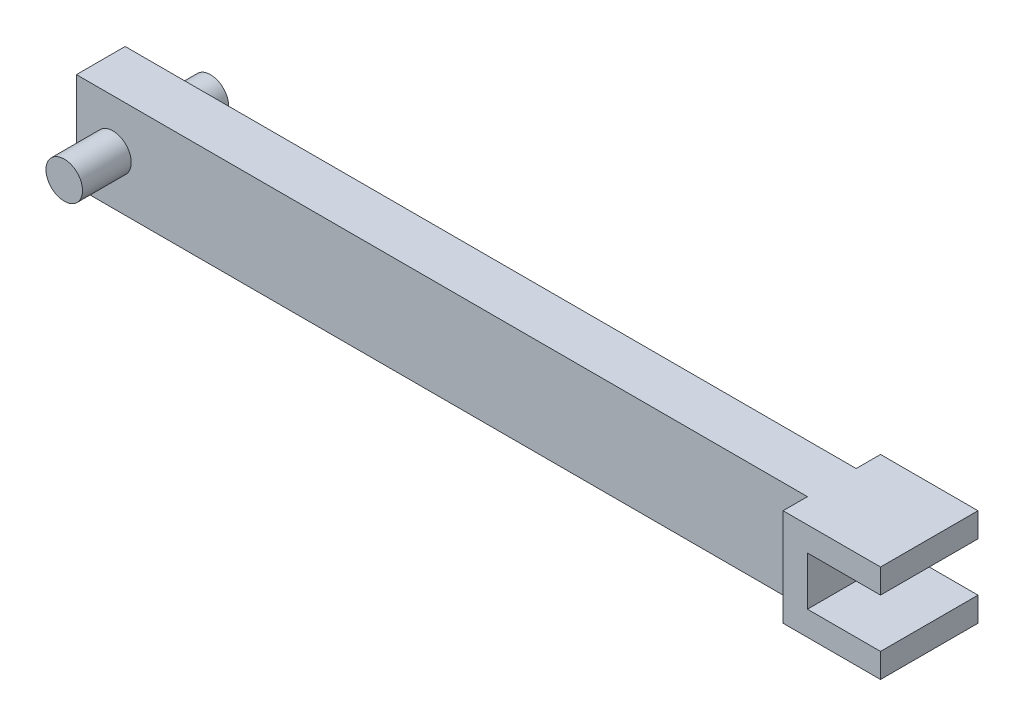
ISO-10303-21;
HEADER;
FILE_DESCRIPTION(('STEP AP214'),'2;1');
FILE_NAME('part.step','',(''),(''),'','','');
FILE_SCHEMA(('AUTOMOTIVE_DESIGN { 1 0 10303 214 1 1 1 1 }'));
ENDSEC;
DATA;
#1=APPLICATION_CONTEXT('core data for automotive mechanical design processes');
#2=APPLICATION_PROTOCOL_DEFINITION('international standard','automotive_design',2000,#1);
#3=PRODUCT_CONTEXT('',#1,'mechanical');
#4=PRODUCT('Part','Part','',(#3));
#5=PRODUCT_RELATED_PRODUCT_CATEGORY('part','',(#4));
#6=PRODUCT_DEFINITION_FORMATION('','',#4);
#7=PRODUCT_DEFINITION_CONTEXT('part definition',#1,'design');
#8=PRODUCT_DEFINITION('design','',#6,#7);
#9=PRODUCT_DEFINITION_SHAPE('','',#8);
#10=(LENGTH_UNIT() NAMED_UNIT(*) SI_UNIT(.MILLI.,.METRE.));
#11=(NAMED_UNIT(*) PLANE_ANGLE_UNIT() SI_UNIT($,.RADIAN.));
#12=(NAMED_UNIT(*) SI_UNIT($,.STERADIAN.) SOLID_ANGLE_UNIT());
#13=UNCERTAINTY_MEASURE_WITH_UNIT(LENGTH_MEASURE(1.E-05),#10,'distance_accuracy_value','');
#14=(GEOMETRIC_REPRESENTATION_CONTEXT(3) GLOBAL_UNCERTAINTY_ASSIGNED_CONTEXT((#13)) GLOBAL_UNIT_ASSIGNED_CONTEXT((#10,
#11,#12)) REPRESENTATION_CONTEXT('',''));
#15=CARTESIAN_POINT('',(0.,0.,0.));
#16=DIRECTION('',(0.,0.,1.));
#17=DIRECTION('',(1.,0.,0.));
#18=AXIS2_PLACEMENT_3D('',#15,#16,#17);
#19=CARTESIAN_POINT('',(190.,0.,0.));
#20=DIRECTION('',(-1.,0.,0.));
#21=DIRECTION('',(0.,0.,1.));
#22=AXIS2_PLACEMENT_3D('',#19,#20,#21);
#23=PLANE('',#22);
#24=DIRECTION('',(0.,1.,0.));
#25=VECTOR('',#24,1.);
#26=CARTESIAN_POINT('',(190.,-20.,-20.));
#27=LINE('',#26,#25);
#28=CARTESIAN_POINT('',(190.,-20.,-20.));
#29=VERTEX_POINT('',#28);
#30=CARTESIAN_POINT('',(190.,-10.,-20.));
#31=VERTEX_POINT('',#30);
#32=EDGE_CURVE('E163',#29,#31,#27,.T.);
#33=ORIENTED_EDGE('',*,*,#32,.T.);
#34=DIRECTION('',(0.,0.,1.));
#35=VECTOR('',#34,1.);
#36=CARTESIAN_POINT('',(190.,-10.,0.));
#37=LINE('',#36,#35);
#38=CARTESIAN_POINT('',(190.,-10.,20.));
#39=VERTEX_POINT('',#38);
#40=EDGE_CURVE('E11',#31,#39,#37,.T.);
#41=ORIENTED_EDGE('',*,*,#40,.T.);
#42=DIRECTION('',(0.,-1.,0.));
#43=VECTOR('',#42,1.);
#44=CARTESIAN_POINT('',(190.,-20.,20.));
#45=LINE('',#44,#43);
#46=CARTESIAN_POINT('',(190.,-20.,20.));
#47=VERTEX_POINT('',#46);
#48=EDGE_CURVE('E169',#39,#47,#45,.T.);
#49=ORIENTED_EDGE('',*,*,#48,.T.);
#50=DIRECTION('',(0.,0.,-1.));
#51=VECTOR('',#50,1.);
#52=CARTESIAN_POINT('',(190.,-20.,20.));
#53=LINE('',#52,#51);
#54=EDGE_CURVE('E172',#47,#29,#53,.T.);
#55=ORIENTED_EDGE('',*,*,#54,.T.);
#56=EDGE_LOOP('',(#33,#41,#49,#55));
#57=FACE_BOUND('',#56,.T.);
#58=ADVANCED_FACE('F33',(#57),#23,.F.);
#59=CARTESIAN_POINT('',(-150.,20.,10.));
#60=DIRECTION('',(0.,-1.,0.));
#61=DIRECTION('',(0.,0.,-1.));
#62=AXIS2_PLACEMENT_3D('',#59,#60,#61);
#63=PLANE('',#62);
#64=DIRECTION('',(-1.,0.,0.));
#65=VECTOR('',#64,1.);
#66=CARTESIAN_POINT('',(-150.,20.,-10.));
#67=LINE('',#66,#65);
#68=CARTESIAN_POINT('',(150.,20.,-10.));
#69=VERTEX_POINT('',#68);
#70=CARTESIAN_POINT('',(-150.,20.,-10.));
#71=VERTEX_POINT('',#70);
#72=EDGE_CURVE('E218',#69,#71,#67,.T.);
#73=ORIENTED_EDGE('',*,*,#72,.T.);
#74=DIRECTION('',(0.,0.,-1.));
#75=VECTOR('',#74,1.);
#76=CARTESIAN_POINT('',(-150.,20.,10.));
#77=LINE('',#76,#75);
#78=CARTESIAN_POINT('',(-150.,20.,10.));
#79=VERTEX_POINT('',#78);
#80=EDGE_CURVE('E224',#79,#71,#77,.T.);
#81=ORIENTED_EDGE('',*,*,#80,.F.);
#82=DIRECTION('',(-1.,0.,0.));
#83=VECTOR('',#82,1.);
#84=CARTESIAN_POINT('',(-150.,20.,10.));
#85=LINE('',#84,#83);
#86=CARTESIAN_POINT('',(150.,20.,10.));
#87=VERTEX_POINT('',#86);
#88=EDGE_CURVE('E210',#87,#79,#85,.T.);
#89=ORIENTED_EDGE('',*,*,#88,.F.);
#90=DIRECTION('',(0.,0.,1.));
#91=VECTOR('',#90,1.);
#92=CARTESIAN_POINT('',(150.,20.,20.));
#93=LINE('',#92,#91);
#94=CARTESIAN_POINT('',(150.,20.,20.));
#95=VERTEX_POINT('',#94);
#96=EDGE_CURVE('E78',#87,#95,#93,.T.);
#97=ORIENTED_EDGE('',*,*,#96,.T.);
#98=DIRECTION('',(-1.,0.,0.));
#99=VECTOR('',#98,1.);
#100=CARTESIAN_POINT('',(190.,20.,20.));
#101=LINE('',#100,#99);
#102=CARTESIAN_POINT('',(190.,20.,20.));
#103=VERTEX_POINT('',#102);
#104=EDGE_CURVE('E191',#103,#95,#101,.T.);
#105=ORIENTED_EDGE('',*,*,#104,.F.);
#106=DIRECTION('',(0.,0.,1.));
#107=VECTOR('',#106,1.);
#108=CARTESIAN_POINT('',(190.,20.,20.));
#109=LINE('',#108,#107);
#110=CARTESIAN_POINT('',(190.,20.,-20.));
#111=VERTEX_POINT('',#110);
#112=EDGE_CURVE('E166',#111,#103,#109,.T.);
#113=ORIENTED_EDGE('',*,*,#112,.F.);
#114=DIRECTION('',(-1.,0.,0.));
#115=VECTOR('',#114,1.);
#116=CARTESIAN_POINT('',(190.,20.,-20.));
#117=LINE('',#116,#115);
#118=CARTESIAN_POINT('',(150.,20.,-20.));
#119=VERTEX_POINT('',#118);
#120=EDGE_CURVE('E194',#111,#119,#117,.T.);
#121=ORIENTED_EDGE('',*,*,#120,.T.);
#122=EDGE_CURVE('E177',#119,#69,#93,.T.);
#123=ORIENTED_EDGE('',*,*,#122,.T.);
#124=EDGE_LOOP('',(#73,#81,#89,#97,#105,#113,#121,#123));
#125=FACE_BOUND('',#124,.T.);
#126=ADVANCED_FACE('F35',(#125),#63,.F.);
#127=CARTESIAN_POINT('',(-150.,20.,10.));
#128=DIRECTION('',(1.,0.,0.));
#129=DIRECTION('',(0.,0.,-1.));
#130=AXIS2_PLACEMENT_3D('',#127,#128,#129);
#131=PLANE('',#130);
#132=DIRECTION('',(0.,-1.,0.));
#133=VECTOR('',#132,1.);
#134=CARTESIAN_POINT('',(-150.,20.,-10.));
#135=LINE('',#134,#133);
#136=CARTESIAN_POINT('',(-150.,-20.,-10.));
#137=VERTEX_POINT('',#136);
#138=EDGE_CURVE('E71',#71,#137,#135,.T.);
#139=ORIENTED_EDGE('',*,*,#138,.T.);
#140=DIRECTION('',(0.,0.,-1.));
#141=VECTOR('',#140,1.);
#142=CARTESIAN_POINT('',(-150.,-20.,10.));
#143=LINE('',#142,#141);
#144=CARTESIAN_POINT('',(-150.,-20.,10.));
#145=VERTEX_POINT('',#144);
#146=EDGE_CURVE('E216',#145,#137,#143,.T.);
#147=ORIENTED_EDGE('',*,*,#146,.F.);
#148=DIRECTION('',(0.,-1.,0.));
#149=VECTOR('',#148,1.);
#150=CARTESIAN_POINT('',(-150.,20.,10.));
#151=LINE('',#150,#149);
#152=EDGE_CURVE('E57',#79,#145,#151,.T.);
#153=ORIENTED_EDGE('',*,*,#152,.F.);
#154=ORIENTED_EDGE('',*,*,#80,.T.);
#155=EDGE_LOOP('',(#139,#147,#153,#154));
#156=FACE_BOUND('',#155,.T.);
#157=ADVANCED_FACE('F248',(#156),#131,.F.);
#158=CARTESIAN_POINT('',(-150.,-20.,10.));
#159=DIRECTION('',(0.,1.,0.));
#160=DIRECTION('',(0.,0.,1.));
#161=AXIS2_PLACEMENT_3D('',#158,#159,#160);
#162=PLANE('',#161);
#163=DIRECTION('',(1.,0.,0.));
#164=VECTOR('',#163,1.);
#165=CARTESIAN_POINT('',(-150.,-20.,-10.));
#166=LINE('',#165,#164);
#167=CARTESIAN_POINT('',(150.,-20.,-10.));
#168=VERTEX_POINT('',#167);
#169=EDGE_CURVE('E211',#137,#168,#166,.T.);
#170=ORIENTED_EDGE('',*,*,#169,.T.);
#171=DIRECTION('',(0.,0.,-1.));
#172=VECTOR('',#171,1.);
#173=CARTESIAN_POINT('',(150.,-20.,20.));
#174=LINE('',#173,#172);
#175=CARTESIAN_POINT('',(150.,-20.,-20.));
#176=VERTEX_POINT('',#175);
#177=EDGE_CURVE('E182',#168,#176,#174,.T.);
#178=ORIENTED_EDGE('',*,*,#177,.T.);
#179=DIRECTION('',(-1.,0.,0.));
#180=VECTOR('',#179,1.);
#181=CARTESIAN_POINT('',(190.,-20.,-20.));
#182=LINE('',#181,#180);
#183=EDGE_CURVE('E174',#29,#176,#182,.T.);
#184=ORIENTED_EDGE('',*,*,#183,.F.);
#185=ORIENTED_EDGE('',*,*,#54,.F.);
#186=DIRECTION('',(-1.,0.,0.));
#187=VECTOR('',#186,1.);
#188=CARTESIAN_POINT('',(190.,-20.,20.));
#189=LINE('',#188,#187);
#190=CARTESIAN_POINT('',(150.,-20.,20.));
#191=VERTEX_POINT('',#190);
#192=EDGE_CURVE('E188',#47,#191,#189,.T.);
#193=ORIENTED_EDGE('',*,*,#192,.T.);
#194=CARTESIAN_POINT('',(150.,-20.,10.));
#195=VERTEX_POINT('',#194);
#196=EDGE_CURVE('E183',#191,#195,#174,.T.);
#197=ORIENTED_EDGE('',*,*,#196,.T.);
#198=DIRECTION('',(1.,0.,0.));
#199=VECTOR('',#198,1.);
#200=CARTESIAN_POINT('',(-150.,-20.,10.));
#201=LINE('',#200,#199);
#202=EDGE_CURVE('E214',#145,#195,#201,.T.);
#203=ORIENTED_EDGE('',*,*,#202,.F.);
#204=ORIENTED_EDGE('',*,*,#146,.T.);
#205=EDGE_LOOP('',(#170,#178,#184,#185,#193,#197,#203,#204));
#206=FACE_BOUND('',#205,.T.);
#207=ADVANCED_FACE('F244',(#206),#162,.F.);
#208=CARTESIAN_POINT('',(0.,0.,10.));
#209=DIRECTION('',(0.,0.,1.));
#210=DIRECTION('',(1.,0.,0.));
#211=AXIS2_PLACEMENT_3D('',#208,#209,#210);
#212=PLANE('',#211);
#213=CARTESIAN_POINT('',(-135.,0.,10.));
#214=DIRECTION('',(0.,0.,1.));
#215=DIRECTION('',(1.,0.,0.));
#216=AXIS2_PLACEMENT_3D('',#213,#214,#215);
#217=CIRCLE('',#216,7.50000000000001);
#218=CARTESIAN_POINT('',(-127.5,0.,10.));
#219=VERTEX_POINT('',#218);
#220=EDGE_CURVE('E201',#219,#219,#217,.F.);
#221=ORIENTED_EDGE('',*,*,#220,.T.);
#222=EDGE_LOOP('',(#221));
#223=FACE_BOUND('',#222,.T.);
#224=DIRECTION('',(0.,1.,0.));
#225=VECTOR('',#224,1.);
#226=CARTESIAN_POINT('',(150.,20.,10.));
#227=LINE('',#226,#225);
#228=EDGE_CURVE('E207',#195,#87,#227,.T.);
#229=ORIENTED_EDGE('',*,*,#228,.T.);
#230=ORIENTED_EDGE('',*,*,#88,.T.);
#231=ORIENTED_EDGE('',*,*,#152,.T.);
#232=ORIENTED_EDGE('',*,*,#202,.T.);
#233=EDGE_LOOP('',(#229,#230,#231,#232));
#234=FACE_BOUND('',#233,.T.);
#235=ADVANCED_FACE('F246',(#223,#234),#212,.T.);
#236=CARTESIAN_POINT('',(0.,0.,-10.));
#237=DIRECTION('',(0.,0.,1.));
#238=DIRECTION('',(1.,0.,0.));
#239=AXIS2_PLACEMENT_3D('',#236,#237,#238);
#240=PLANE('',#239);
#241=CARTESIAN_POINT('',(-135.,0.,-10.));
#242=DIRECTION('',(0.,0.,1.));
#243=DIRECTION('',(1.,0.,0.));
#244=AXIS2_PLACEMENT_3D('',#241,#242,#243);
#245=CIRCLE('',#244,7.50000000000001);
#246=CARTESIAN_POINT('',(-127.5,0.,-10.));
#247=VERTEX_POINT('',#246);
#248=EDGE_CURVE('E226',#247,#247,#245,.F.);
#249=ORIENTED_EDGE('',*,*,#248,.F.);
#250=EDGE_LOOP('',(#249));
#251=FACE_BOUND('',#250,.T.);
#252=DIRECTION('',(0.,1.,0.));
#253=VECTOR('',#252,1.);
#254=CARTESIAN_POINT('',(150.,20.,-10.));
#255=LINE('',#254,#253);
#256=EDGE_CURVE('E206',#168,#69,#255,.T.);
#257=ORIENTED_EDGE('',*,*,#256,.F.);
#258=ORIENTED_EDGE('',*,*,#169,.F.);
#259=ORIENTED_EDGE('',*,*,#138,.F.);
#260=ORIENTED_EDGE('',*,*,#72,.F.);
#261=EDGE_LOOP('',(#257,#258,#259,#260));
#262=FACE_BOUND('',#261,.T.);
#263=ADVANCED_FACE('F252',(#251,#262),#240,.F.);
#264=CARTESIAN_POINT('',(-135.,0.,-30.));
#265=DIRECTION('',(0.,0.,1.));
#266=DIRECTION('',(1.,0.,0.));
#267=AXIS2_PLACEMENT_3D('',#264,#265,#266);
#268=PLANE('',#267);
#269=CARTESIAN_POINT('',(-135.,0.,-30.));
#270=DIRECTION('',(0.,0.,1.));
#271=DIRECTION('',(1.,0.,0.));
#272=AXIS2_PLACEMENT_3D('',#269,#270,#271);
#273=CIRCLE('',#272,7.50000000000001);
#274=CARTESIAN_POINT('',(-127.5,0.,-30.));
#275=VERTEX_POINT('',#274);
#276=EDGE_CURVE('E197',#275,#275,#273,.T.);
#277=ORIENTED_EDGE('',*,*,#276,.F.);
#278=EDGE_LOOP('',(#277));
#279=FACE_BOUND('',#278,.T.);
#280=ADVANCED_FACE('F290',(#279),#268,.F.);
#281=CARTESIAN_POINT('',(-135.,0.,30.));
#282=DIRECTION('',(0.,0.,-1.));
#283=DIRECTION('',(-1.,0.,0.));
#284=AXIS2_PLACEMENT_3D('',#281,#282,#283);
#285=CYLINDRICAL_SURFACE('',#284,7.50000000000001);
#286=ORIENTED_EDGE('',*,*,#276,.T.);
#287=EDGE_LOOP('',(#286));
#288=FACE_BOUND('',#287,.T.);
#289=ORIENTED_EDGE('',*,*,#248,.T.);
#290=EDGE_LOOP('',(#289));
#291=FACE_BOUND('',#290,.T.);
#292=ADVANCED_FACE('F293',(#288,#291),#285,.T.);
#293=ORIENTED_EDGE('',*,*,#220,.F.);
#294=EDGE_LOOP('',(#293));
#295=FACE_BOUND('',#294,.T.);
#296=CARTESIAN_POINT('',(-135.,0.,30.));
#297=DIRECTION('',(0.,0.,1.));
#298=DIRECTION('',(1.,0.,0.));
#299=AXIS2_PLACEMENT_3D('',#296,#297,#298);
#300=CIRCLE('',#299,7.50000000000001);
#301=CARTESIAN_POINT('',(-127.5,0.,30.));
#302=VERTEX_POINT('',#301);
#303=EDGE_CURVE('E198',#302,#302,#300,.T.);
#304=ORIENTED_EDGE('',*,*,#303,.F.);
#305=EDGE_LOOP('',(#304));
#306=FACE_BOUND('',#305,.T.);
#307=ADVANCED_FACE('F288',(#295,#306),#285,.T.);
#308=CARTESIAN_POINT('',(-135.,0.,30.));
#309=DIRECTION('',(0.,0.,1.));
#310=DIRECTION('',(1.,0.,0.));
#311=AXIS2_PLACEMENT_3D('',#308,#309,#310);
#312=PLANE('',#311);
#313=ORIENTED_EDGE('',*,*,#303,.T.);
#314=EDGE_LOOP('',(#313));
#315=FACE_BOUND('',#314,.T.);
#316=ADVANCED_FACE('F285',(#315),#312,.T.);
#317=CARTESIAN_POINT('',(150.,0.,0.));
#318=DIRECTION('',(-1.,0.,0.));
#319=DIRECTION('',(0.,0.,1.));
#320=AXIS2_PLACEMENT_3D('',#317,#318,#319);
#321=PLANE('',#320);
#322=ORIENTED_EDGE('',*,*,#228,.F.);
#323=ORIENTED_EDGE('',*,*,#196,.F.);
#324=DIRECTION('',(0.,-1.,0.));
#325=VECTOR('',#324,1.);
#326=CARTESIAN_POINT('',(150.,-20.,20.));
#327=LINE('',#326,#325);
#328=EDGE_CURVE('E180',#95,#191,#327,.T.);
#329=ORIENTED_EDGE('',*,*,#328,.F.);
#330=ORIENTED_EDGE('',*,*,#96,.F.);
#331=EDGE_LOOP('',(#322,#323,#329,#330));
#332=FACE_BOUND('',#331,.T.);
#333=ADVANCED_FACE('F241',(#332),#321,.T.);
#334=CARTESIAN_POINT('',(190.,-20.,-20.));
#335=DIRECTION('',(0.,0.,1.));
#336=DIRECTION('',(1.,0.,0.));
#337=AXIS2_PLACEMENT_3D('',#334,#335,#336);
#338=PLANE('',#337);
#339=DIRECTION('',(0.,-1.,0.));
#340=VECTOR('',#339,1.);
#341=CARTESIAN_POINT('',(160.,-20.,-20.));
#342=LINE('',#341,#340);
#343=CARTESIAN_POINT('',(160.,10.,-20.));
#344=VERTEX_POINT('',#343);
#345=CARTESIAN_POINT('',(160.,-10.,-20.));
#346=VERTEX_POINT('',#345);
#347=EDGE_CURVE('E140',#344,#346,#342,.T.);
#348=ORIENTED_EDGE('',*,*,#347,.T.);
#349=DIRECTION('',(1.,0.,0.));
#350=VECTOR('',#349,1.);
#351=CARTESIAN_POINT('',(190.,-10.,-20.));
#352=LINE('',#351,#350);
#353=EDGE_CURVE('E158',#346,#31,#352,.T.);
#354=ORIENTED_EDGE('',*,*,#353,.T.);
#355=ORIENTED_EDGE('',*,*,#32,.F.);
#356=ORIENTED_EDGE('',*,*,#183,.T.);
#357=DIRECTION('',(0.,1.,0.));
#358=VECTOR('',#357,1.);
#359=CARTESIAN_POINT('',(150.,-20.,-20.));
#360=LINE('',#359,#358);
#361=EDGE_CURVE('E162',#176,#119,#360,.T.);
#362=ORIENTED_EDGE('',*,*,#361,.T.);
#363=ORIENTED_EDGE('',*,*,#120,.F.);
#364=CARTESIAN_POINT('',(190.,9.99999999999999,-20.));
#365=VERTEX_POINT('',#364);
#366=EDGE_CURVE('E167',#365,#111,#27,.T.);
#367=ORIENTED_EDGE('',*,*,#366,.F.);
#368=DIRECTION('',(-1.,0.,0.));
#369=VECTOR('',#368,1.);
#370=CARTESIAN_POINT('',(190.,9.99999999999999,-20.));
#371=LINE('',#370,#369);
#372=EDGE_CURVE('E48',#365,#344,#371,.T.);
#373=ORIENTED_EDGE('',*,*,#372,.T.);
#374=EDGE_LOOP('',(#348,#354,#355,#356,#362,#363,#367,#373));
#375=FACE_BOUND('',#374,.T.);
#376=ADVANCED_FACE('F234',(#375),#338,.F.);
#377=CARTESIAN_POINT('',(190.,-20.,20.));
#378=DIRECTION('',(0.,0.,-1.));
#379=DIRECTION('',(-1.,0.,0.));
#380=AXIS2_PLACEMENT_3D('',#377,#378,#379);
#381=PLANE('',#380);
#382=ORIENTED_EDGE('',*,*,#48,.F.);
#383=DIRECTION('',(1.,0.,0.));
#384=VECTOR('',#383,1.);
#385=CARTESIAN_POINT('',(160.,-10.,20.));
#386=LINE('',#385,#384);
#387=CARTESIAN_POINT('',(160.,-10.,20.));
#388=VERTEX_POINT('',#387);
#389=EDGE_CURVE('E142',#388,#39,#386,.T.);
#390=ORIENTED_EDGE('',*,*,#389,.F.);
#391=DIRECTION('',(0.,-1.,0.));
#392=VECTOR('',#391,1.);
#393=CARTESIAN_POINT('',(160.,-10.,20.));
#394=LINE('',#393,#392);
#395=CARTESIAN_POINT('',(160.,10.,20.));
#396=VERTEX_POINT('',#395);
#397=EDGE_CURVE('E137',#396,#388,#394,.T.);
#398=ORIENTED_EDGE('',*,*,#397,.F.);
#399=DIRECTION('',(-1.,0.,0.));
#400=VECTOR('',#399,1.);
#401=CARTESIAN_POINT('',(160.,10.,20.));
#402=LINE('',#401,#400);
#403=CARTESIAN_POINT('',(190.,10.,20.));
#404=VERTEX_POINT('',#403);
#405=EDGE_CURVE('E145',#404,#396,#402,.T.);
#406=ORIENTED_EDGE('',*,*,#405,.F.);
#407=EDGE_CURVE('E170',#103,#404,#45,.T.);
#408=ORIENTED_EDGE('',*,*,#407,.F.);
#409=ORIENTED_EDGE('',*,*,#104,.T.);
#410=ORIENTED_EDGE('',*,*,#328,.T.);
#411=ORIENTED_EDGE('',*,*,#192,.F.);
#412=EDGE_LOOP('',(#382,#390,#398,#406,#408,#409,#410,#411));
#413=FACE_BOUND('',#412,.T.);
#414=ADVANCED_FACE('F152',(#413),#381,.F.);
#415=ORIENTED_EDGE('',*,*,#407,.T.);
#416=DIRECTION('',(0.,0.,-1.));
#417=VECTOR('',#416,1.);
#418=CARTESIAN_POINT('',(190.,10.,0.));
#419=LINE('',#418,#417);
#420=EDGE_CURVE('E41',#404,#365,#419,.T.);
#421=ORIENTED_EDGE('',*,*,#420,.T.);
#422=ORIENTED_EDGE('',*,*,#366,.T.);
#423=ORIENTED_EDGE('',*,*,#112,.T.);
#424=EDGE_LOOP('',(#415,#421,#422,#423));
#425=FACE_BOUND('',#424,.T.);
#426=ADVANCED_FACE('F230',(#425),#23,.F.);
#427=ORIENTED_EDGE('',*,*,#177,.F.);
#428=ORIENTED_EDGE('',*,*,#256,.T.);
#429=ORIENTED_EDGE('',*,*,#122,.F.);
#430=ORIENTED_EDGE('',*,*,#361,.F.);
#431=EDGE_LOOP('',(#427,#428,#429,#430));
#432=FACE_BOUND('',#431,.T.);
#433=ADVANCED_FACE('F254',(#432),#321,.T.);
#434=CARTESIAN_POINT('',(160.,-10.,-38.));
#435=DIRECTION('',(-1.,0.,0.));
#436=DIRECTION('',(0.,0.,1.));
#437=AXIS2_PLACEMENT_3D('',#434,#435,#436);
#438=PLANE('',#437);
#439=DIRECTION('',(0.,0.,1.));
#440=VECTOR('',#439,1.);
#441=CARTESIAN_POINT('',(160.,10.,-38.));
#442=LINE('',#441,#440);
#443=EDGE_CURVE('E132',#344,#396,#442,.T.);
#444=ORIENTED_EDGE('',*,*,#443,.T.);
#445=ORIENTED_EDGE('',*,*,#397,.T.);
#446=DIRECTION('',(0.,0.,1.));
#447=VECTOR('',#446,1.);
#448=CARTESIAN_POINT('',(160.,-10.,-38.));
#449=LINE('',#448,#447);
#450=EDGE_CURVE('E141',#346,#388,#449,.T.);
#451=ORIENTED_EDGE('',*,*,#450,.F.);
#452=ORIENTED_EDGE('',*,*,#347,.F.);
#453=EDGE_LOOP('',(#444,#445,#451,#452));
#454=FACE_BOUND('',#453,.T.);
#455=ADVANCED_FACE('F134',(#454),#438,.F.);
#456=CARTESIAN_POINT('',(160.,-10.,-38.));
#457=DIRECTION('',(0.,-1.,0.));
#458=DIRECTION('',(0.,0.,-1.));
#459=AXIS2_PLACEMENT_3D('',#456,#457,#458);
#460=PLANE('',#459);
#461=ORIENTED_EDGE('',*,*,#450,.T.);
#462=ORIENTED_EDGE('',*,*,#389,.T.);
#463=ORIENTED_EDGE('',*,*,#40,.F.);
#464=ORIENTED_EDGE('',*,*,#353,.F.);
#465=EDGE_LOOP('',(#461,#462,#463,#464));
#466=FACE_BOUND('',#465,.T.);
#467=ADVANCED_FACE('F259',(#466),#460,.F.);
#468=CARTESIAN_POINT('',(160.,10.,-38.));
#469=DIRECTION('',(0.,1.,0.));
#470=DIRECTION('',(0.,0.,1.));
#471=AXIS2_PLACEMENT_3D('',#468,#469,#470);
#472=PLANE('',#471);
#473=ORIENTED_EDGE('',*,*,#420,.F.);
#474=ORIENTED_EDGE('',*,*,#405,.T.);
#475=ORIENTED_EDGE('',*,*,#443,.F.);
#476=ORIENTED_EDGE('',*,*,#372,.F.);
#477=EDGE_LOOP('',(#473,#474,#475,#476));
#478=FACE_BOUND('',#477,.T.);
#479=ADVANCED_FACE('F146',(#478),#472,.F.);
#480=CLOSED_SHELL('',(#58,#126,#157,#207,#235,#263,#280,#292,#307,#316,#333,#376,#414,#426,#433,
#455,#467,#479));
#481=MANIFOLD_SOLID_BREP('B2',#480);
#482=ADVANCED_BREP_SHAPE_REPRESENTATION('',(#18,#481),#14);
#483=SHAPE_DEFINITION_REPRESENTATION(#9,#482);
ENDSEC;
END-ISO-10303-21;
